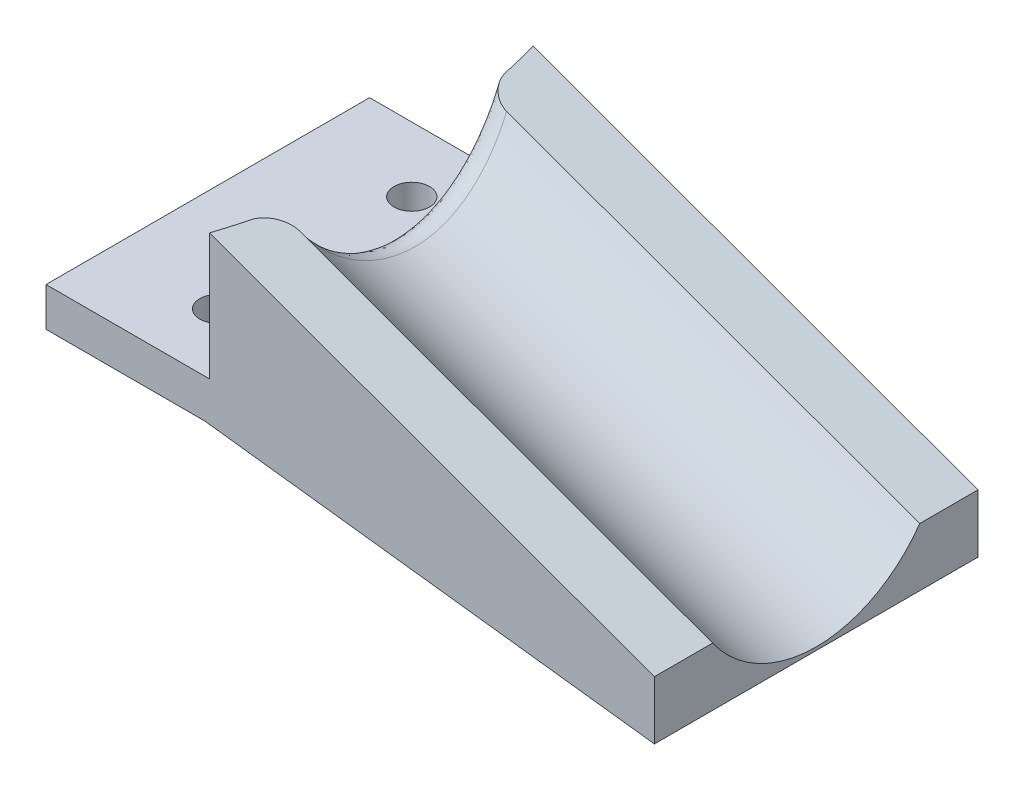
ISO-10303-21;
HEADER;
FILE_DESCRIPTION(('STEP AP214'),'2;1');
FILE_NAME('part.step','',(''),(''),'','','');
FILE_SCHEMA(('AUTOMOTIVE_DESIGN { 1 0 10303 214 1 1 1 1 }'));
ENDSEC;
DATA;
#1=APPLICATION_CONTEXT('core data for automotive mechanical design processes');
#2=APPLICATION_PROTOCOL_DEFINITION('international standard','automotive_design',2000,#1);
#3=PRODUCT_CONTEXT('',#1,'mechanical');
#4=PRODUCT('Part','Part','',(#3));
#5=PRODUCT_RELATED_PRODUCT_CATEGORY('part','',(#4));
#6=PRODUCT_DEFINITION_FORMATION('','',#4);
#7=PRODUCT_DEFINITION_CONTEXT('part definition',#1,'design');
#8=PRODUCT_DEFINITION('design','',#6,#7);
#9=PRODUCT_DEFINITION_SHAPE('','',#8);
#10=(LENGTH_UNIT() NAMED_UNIT(*) SI_UNIT(.MILLI.,.METRE.));
#11=(NAMED_UNIT(*) PLANE_ANGLE_UNIT() SI_UNIT($,.RADIAN.));
#12=(NAMED_UNIT(*) SI_UNIT($,.STERADIAN.) SOLID_ANGLE_UNIT());
#13=UNCERTAINTY_MEASURE_WITH_UNIT(LENGTH_MEASURE(1.E-05),#10,'distance_accuracy_value','');
#14=(GEOMETRIC_REPRESENTATION_CONTEXT(3) GLOBAL_UNCERTAINTY_ASSIGNED_CONTEXT((#13)) GLOBAL_UNIT_ASSIGNED_CONTEXT((#10,
#11,#12)) REPRESENTATION_CONTEXT('',''));
#15=CARTESIAN_POINT('',(0.,0.,0.));
#16=DIRECTION('',(0.,0.,1.));
#17=DIRECTION('',(1.,0.,0.));
#18=AXIS2_PLACEMENT_3D('',#15,#16,#17);
#19=CARTESIAN_POINT('',(-24.5152899298143,26.,50.));
#20=DIRECTION('',(1.,0.,0.));
#21=DIRECTION('',(0.,1.,0.));
#22=AXIS2_PLACEMENT_3D('',#19,#20,#21);
#23=PLANE('',#22);
#24=DIRECTION('',(0.,0.,1.));
#25=VECTOR('',#24,1.);
#26=CARTESIAN_POINT('',(-24.5152899298143,6.,50.));
#27=LINE('',#26,#25);
#28=CARTESIAN_POINT('',(-24.5152899298143,6.,0.));
#29=VERTEX_POINT('',#28);
#30=CARTESIAN_POINT('',(-24.5152899298143,6.,50.));
#31=VERTEX_POINT('',#30);
#32=EDGE_CURVE('E120',#29,#31,#27,.T.);
#33=ORIENTED_EDGE('',*,*,#32,.F.);
#34=DIRECTION('',(0.,-1.,0.));
#35=VECTOR('',#34,1.);
#36=CARTESIAN_POINT('',(-24.5152899298143,26.,0.));
#37=LINE('',#36,#35);
#38=CARTESIAN_POINT('',(-24.5152899298143,0.,0.));
#39=VERTEX_POINT('',#38);
#40=EDGE_CURVE('E150',#29,#39,#37,.T.);
#41=ORIENTED_EDGE('',*,*,#40,.T.);
#42=DIRECTION('',(0.,0.,-1.));
#43=VECTOR('',#42,1.);
#44=CARTESIAN_POINT('',(-24.5152899298143,0.,50.));
#45=LINE('',#44,#43);
#46=CARTESIAN_POINT('',(-24.5152899298143,0.,50.));
#47=VERTEX_POINT('',#46);
#48=EDGE_CURVE('E181',#47,#39,#45,.T.);
#49=ORIENTED_EDGE('',*,*,#48,.F.);
#50=DIRECTION('',(0.,-1.,0.));
#51=VECTOR('',#50,1.);
#52=CARTESIAN_POINT('',(-24.5152899298143,26.,50.));
#53=LINE('',#52,#51);
#54=EDGE_CURVE('E151',#31,#47,#53,.T.);
#55=ORIENTED_EDGE('',*,*,#54,.F.);
#56=EDGE_LOOP('',(#33,#41,#49,#55));
#57=FACE_BOUND('',#56,.T.);
#58=ADVANCED_FACE('F35',(#57),#23,.F.);
#59=CARTESIAN_POINT('',(69.4847100701857,0.522083601365774,50.));
#60=DIRECTION('',(-0.342020143325669,-0.939692620785908,0.));
#61=DIRECTION('',(0.939692620785908,-0.342020143325669,0.));
#62=AXIS2_PLACEMENT_3D('',#59,#60,#61);
#63=PLANE('',#62);
#64=DIRECTION('',(-0.939692620785908,0.342020143325669,0.));
#65=VECTOR('',#64,1.);
#66=CARTESIAN_POINT('',(72.3772543137752,-0.530716404598843,41.));
#67=LINE('',#66,#65);
#68=CARTESIAN_POINT('',(69.4847100701857,0.522083601365774,41.));
#69=VERTEX_POINT('',#68);
#70=CARTESIAN_POINT('',(5.6631072728891,23.7512473227424,41.));
#71=VERTEX_POINT('',#70);
#72=EDGE_CURVE('E148',#69,#71,#67,.T.);
#73=ORIENTED_EDGE('',*,*,#72,.T.);
#74=CARTESIAN_POINT('',(4.53305028891192,32.6141130901676,44.5839617815843));
#75=CARTESIAN_POINT('',(1.87655288740507,32.5537543773198,44.3839362590256));
#76=CARTESIAN_POINT('',(1.37953567465181,32.0421034885877,46.9513900729025));
#77=CARTESIAN_POINT('',(4.5907164275636,31.9627858274667,44.4612343720084));
#78=CARTESIAN_POINT('',(1.90363779418791,31.8954424572678,44.227156099155));
#79=CARTESIAN_POINT('',(1.4061231947591,31.3072857898055,46.813826628591));
#80=CARTESIAN_POINT('',(4.65379046659992,31.3166624031764,44.3118541580335));
#81=CARTESIAN_POINT('',(1.93507341233363,31.2490142478684,44.042789608648));
#82=CARTESIAN_POINT('',(1.43831871577798,30.5786219050923,46.6463884267401));
#83=CARTESIAN_POINT('',(4.78921905508307,30.0392365502929,43.9612771985362));
#84=CARTESIAN_POINT('',(2.00533760430166,29.9778318773506,43.621416944562));
#85=CARTESIAN_POINT('',(1.51261045572394,29.1385256264655,46.2534315941969));
#86=CARTESIAN_POINT('',(4.86157338130341,29.4079337656384,43.7600816992529));
#87=CARTESIAN_POINT('',(2.04428383174336,29.352837107054,43.3836043332659));
#88=CARTESIAN_POINT('',(1.55470643652728,28.4270928185674,46.0279143603968));
#89=CARTESIAN_POINT('',(5.01418836533513,28.1632405953843,43.3068874500854));
#90=CARTESIAN_POINT('',(2.12823185432664,28.1284480842535,42.857454486016));
#91=CARTESIAN_POINT('',(1.64758146535138,27.0248933156347,45.5199352367412));
#92=CARTESIAN_POINT('',(5.09446511889189,27.5498901005874,43.0547841389684));
#93=CARTESIAN_POINT('',(2.17335292237186,27.5290582403861,42.5681772516031));
#94=CARTESIAN_POINT('',(1.69837835131933,26.3341725710333,45.237356145656));
#95=CARTESIAN_POINT('',(5.26098201093775,26.3468355127653,42.5015462815861));
#96=CARTESIAN_POINT('',(2.2679464329965,26.3620400388248,41.9424941783369));
#97=CARTESIAN_POINT('',(1.80699763594809,24.9797970176115,44.6172395346495));
#98=CARTESIAN_POINT('',(5.34722217414156,25.7571315177564,42.2004115321086));
#99=CARTESIAN_POINT('',(2.31750625340779,25.794538766886,41.6052516301065));
#100=CARTESIAN_POINT('',(1.86482006372622,24.3161423209815,44.2797017869502));
#101=CARTESIAN_POINT('',(5.52372675286616,24.6054918837898,41.5504706943836));
#102=CARTESIAN_POINT('',(2.41925930650299,24.6956600763219,40.8867768528871));
#103=CARTESIAN_POINT('',(1.98576091216141,23.0204733005394,43.5511921517319));
#104=CARTESIAN_POINT('',(5.6139933595141,24.0435717238455,41.2016384312954));
#105=CARTESIAN_POINT('',(2.47151126806748,24.1646461618615,40.5047374896402));
#106=CARTESIAN_POINT('',(2.04888223328463,22.38847661162,43.1601909251983));
#107=CARTESIAN_POINT('',(5.79633726216196,22.9524609385074,40.4580661818827));
#108=CARTESIAN_POINT('',(2.5768053793304,23.1435537734331,39.7005601106313));
#109=CARTESIAN_POINT('',(2.17845860652451,21.1616351959335,42.3267311443745));
#110=CARTESIAN_POINT('',(5.88841449858941,22.4232692386641,40.0633277038499));
#111=CARTESIAN_POINT('',(2.62986736249774,22.6540345137052,39.2777438399405));
#112=CARTESIAN_POINT('',(2.24491354907116,20.5667892495306,41.8842742807074));
#113=CARTESIAN_POINT('',(6.07205162024009,21.4024755703972,39.2297869969698));
#114=CARTESIAN_POINT('',(2.73496063759829,21.7201316963794,38.396206932468));
#115=CARTESIAN_POINT('',(2.37907662084911,19.4196410323435,40.9499701086291));
#116=CARTESIAN_POINT('',(6.1636115624363,20.9108693846297,38.7909897246308));
#117=CARTESIAN_POINT('',(2.7869684956093,21.2765231173063,37.9369810719154));
#118=CARTESIAN_POINT('',(2.44678460841838,18.8673339883607,40.4581283558989));
#119=CARTESIAN_POINT('',(6.34376456883833,19.9702989377582,37.8714381699681));
#120=CARTESIAN_POINT('',(2.88821182592266,20.4381436092399,36.9872236077461));
#121=CARTESIAN_POINT('',(2.58126175938907,17.8108668596887,39.4274158221595));
#122=CARTESIAN_POINT('',(6.4323578747926,19.5213311965851,37.3906873179725));
#123=CARTESIAN_POINT('',(2.93737875071517,20.0443503456445,36.4964269888582));
#124=CARTESIAN_POINT('',(2.64803099902969,17.3067028456383,38.8885488861572));
#125=CARTESIAN_POINT('',(6.60056685077466,18.6884933652248,36.4100063463968));
#126=CARTESIAN_POINT('',(3.02943602337729,19.323733481519,35.5091527792525));
#127=CARTESIAN_POINT('',(2.77572443137881,16.3716620658836,37.7893172401707));
#128=CARTESIAN_POINT('',(6.68040044754672,18.3027288224037,35.911630297307));
#129=CARTESIAN_POINT('',(3.07242707597662,18.9956680939999,35.0134509354231));
#130=CARTESIAN_POINT('',(2.83677574312848,15.9386504270259,37.2306944661599));
#131=CARTESIAN_POINT('',(6.83268306911995,17.5802943352104,34.8815874726918));
#132=CARTESIAN_POINT('',(3.1532043497128,18.3894485089438,34.0025341029411));
#133=CARTESIAN_POINT('',(2.95386133756742,15.127868487638,36.0761338064164));
#134=CARTESIAN_POINT('',(6.9051333978232,17.2436157176126,34.3499266022083));
#135=CARTESIAN_POINT('',(3.19086684789304,18.1123750336852,33.4876799966404));
#136=CARTESIAN_POINT('',(3.00989650590586,14.7500884279446,35.4802025395629));
#137=CARTESIAN_POINT('',(7.04025067353508,16.6248811970469,33.2581380251989));
#138=CARTESIAN_POINT('',(3.25999887680914,17.6098452339943,32.4442261889963));
#139=CARTESIAN_POINT('',(3.11483046576302,14.0559143360374,34.2564319257144));
#140=CARTESIAN_POINT('',(7.10293996885691,16.342700152228,32.6980793570326));
#141=CARTESIAN_POINT('',(3.29134534336336,17.3853532809383,31.9163499549499));
#142=CARTESIAN_POINT('',(3.16374554178713,13.7393796639087,33.6286699628554));
#143=CARTESIAN_POINT('',(7.21660143061719,15.8367621720135,31.5531395982926));
#144=CARTESIAN_POINT('',(3.34733316917991,16.9875796062449,30.8501958333593));
#145=CARTESIAN_POINT('',(3.25270007610988,13.1719080252645,32.3453229294817));
#146=CARTESIAN_POINT('',(7.26758034513614,15.6129715790999,30.9682730345818));
#147=CARTESIAN_POINT('',(3.37184244389363,16.8152741198281,30.3129714410826));
#148=CARTESIAN_POINT('',(3.29274464554091,12.9209332684992,31.6897541419253));
#149=CARTESIAN_POINT('',(7.35567990056732,15.2292342026559,29.7835348244873));
#150=CARTESIAN_POINT('',(3.41368670755242,16.522504141323,29.2356577419733));
#151=CARTESIAN_POINT('',(3.36208927294274,12.4906157951227,30.3617975785881));
#152=CARTESIAN_POINT('',(7.39290746296024,15.0687941426516,29.1838193780346));
#153=CARTESIAN_POINT('',(3.43096315640296,16.4024505397482,28.696926730168));
#154=CARTESIAN_POINT('',(3.39147219577757,12.3107196205105,29.6895848851348));
#155=CARTESIAN_POINT('',(7.45266868784675,14.8124011485189,27.970960079815));
#156=CARTESIAN_POINT('',(3.45850484663513,16.2115154029474,27.6148132126574));
#157=CARTESIAN_POINT('',(3.43869499669692,12.0232475527969,28.330107785675));
#158=CARTESIAN_POINT('',(7.47520212818264,14.7164491893733,27.3578160251684));
#159=CARTESIAN_POINT('',(3.46868648143873,16.1412169347822,27.073005365601));
#160=CARTESIAN_POINT('',(3.45653470026162,11.915672753108,27.6428431522632));
#161=CARTESIAN_POINT('',(7.50191951281904,14.6028494231033,26.2411713971609));
#162=CARTESIAN_POINT('',(3.48074829758522,16.0579933328177,26.0892104826803));
#163=CARTESIAN_POINT('',(3.47769473562816,11.788314339485,26.3912117369429));
#164=CARTESIAN_POINT('',(7.50876011034656,14.5738573543196,25.7387701656128));
#165=CARTESIAN_POINT('',(3.48380756073559,16.0369167393848,25.6484441105287));
#166=CARTESIAN_POINT('',(3.48311684807557,11.7558119534134,25.8280771919631));
#167=CARTESIAN_POINT('',(7.51201650039116,14.5600456611167,24.7332078617102));
#168=CARTESIAN_POINT('',(3.4852697835641,16.0268392980283,24.7657120262507));
#169=CARTESIAN_POINT('',(3.48569749796867,11.740327842874,24.7009564070174));
#170=CARTESIAN_POINT('',(7.50842954121323,14.5752376963017,24.2300466238172));
#171=CARTESIAN_POINT('',(3.4836683859264,16.0378684712325,24.3246928714767));
#172=CARTESIAN_POINT('',(3.48285385419008,11.7573591897071,24.1369699815018));
#173=CARTESIAN_POINT('',(7.49090725056016,14.6496515433464,23.2264288528551));
#174=CARTESIAN_POINT('',(3.47577732623572,16.0922838931896,23.4418629968749));
#175=CARTESIAN_POINT('',(3.46897209338013,11.8407846654846,23.0120287964548));
#176=CARTESIAN_POINT('',(7.47696158601401,14.7089173199489,22.725975523449));
#177=CARTESIAN_POINT('',(3.46949976716955,16.135586659722,23.0009876648862));
#178=CARTESIAN_POINT('',(3.45792579399528,11.907228084301,22.4510776278647));
#179=CARTESIAN_POINT('',(7.43907690131357,14.870689720941,21.7319925033563));
#180=CARTESIAN_POINT('',(3.4522211050532,16.2550681171054,22.1198069657589));
#181=CARTESIAN_POINT('',(3.42795375124514,12.0886013936474,21.3369359009152));
#182=CARTESIAN_POINT('',(7.41513849183118,14.9731937029819,21.2384623914859));
#183=CARTESIAN_POINT('',(3.44125587256646,16.3309979329677,21.680387721071));
#184=CARTESIAN_POINT('',(3.40902848937546,12.2035283212805,20.7837448704568));
#185=CARTESIAN_POINT('',(7.35795667482965,15.2197196161397,20.2631037559178));
#186=CARTESIAN_POINT('',(3.41463353797897,16.5160819293447,20.8045849147502));
#187=CARTESIAN_POINT('',(3.36390026880616,12.4799507310892,19.6904789567912));
#188=CARTESIAN_POINT('',(7.32473908444825,15.3636263865187,19.781246740084));
#189=CARTESIAN_POINT('',(3.39904107182342,16.6247816336948,20.3689985549127));
#190=CARTESIAN_POINT('',(3.33771750394141,12.6413170437234,19.1503721371452));
#191=CARTESIAN_POINT('',(7.24977980133243,15.6912486121408,18.8309374571792));
#192=CARTESIAN_POINT('',(3.36321494482865,16.8760161201158,19.5013678588864));
#193=CARTESIAN_POINT('',(3.27876844274802,13.0087202077874,18.0851836940905));
#194=CARTESIAN_POINT('',(7.20803799008482,15.8749646208583,18.3624853765817));
#195=CARTESIAN_POINT('',(3.34304467433076,17.0180968838208,19.070004856108));
#196=CARTESIAN_POINT('',(3.24600205488664,13.2147576802877,17.5601022796974));
#197=CARTESIAN_POINT('',(7.11700586272657,16.280009829298,17.4418326697809));
#198=CARTESIAN_POINT('',(3.2982322100214,17.3363786624571,18.2130544754454));
#199=CARTESIAN_POINT('',(3.17475016856622,13.6690639024286,16.5281554798601));
#200=CARTESIAN_POINT('',(7.06771709858899,16.5013312967699,16.9896287258249));
#201=CARTESIAN_POINT('',(3.27366151033478,17.512050708011,17.7880143642498));
#202=CARTESIAN_POINT('',(3.13626584600477,13.9173239704758,16.0212863755933));
#203=CARTESIAN_POINT('',(6.96264306064047,16.9793235116096,16.1035729504581));
#204=CARTESIAN_POINT('',(3.2203318561526,17.8975576443004,16.9459403207897));
#205=CARTESIAN_POINT('',(3.05451506631181,14.4535623257063,15.0281187944673));
#206=CARTESIAN_POINT('',(6.9068552800103,17.2360079062845,15.6697282891913));
#207=CARTESIAN_POINT('',(3.19164328035692,18.1068467432569,16.5293111532264));
#208=CARTESIAN_POINT('',(3.01124676421977,14.7415559469767,14.5418283545227));
#209=CARTESIAN_POINT('',(6.78739465968132,17.7940827823162,14.8041178652171));
#210=CARTESIAN_POINT('',(3.12919529101826,18.5688621500089,15.6891404433941));
#211=CARTESIAN_POINT('',(2.91899054481312,15.3677906150537,13.5715776831089));
#212=CARTESIAN_POINT('',(6.72348440641157,18.0969321045106,14.3732631872895));
#213=CARTESIAN_POINT('',(3.09533011897519,18.8225630545853,15.2661656864722));
#214=CARTESIAN_POINT('',(2.86983571291649,15.7076722855432,13.0886386738844));
#215=CARTESIAN_POINT('',(6.59117907824705,18.7355212581285,13.5357211193824));
#216=CARTESIAN_POINT('',(3.0241598238295,19.3656521052173,14.4350274326527));
#217=CARTESIAN_POINT('',(2.76862354435009,16.4244663841375,12.1498494318851));
#218=CARTESIAN_POINT('',(6.52278238859705,19.0712729534682,13.1290425323532));
#219=CARTESIAN_POINT('',(2.98692007380614,19.6544325851048,14.0269934125229));
#220=CARTESIAN_POINT('',(2.71656516365735,16.801392169728,11.6940090662145));
#221=CARTESIAN_POINT('',(6.31288955054332,20.123607186332,11.9478394642142));
#222=CARTESIAN_POINT('',(2.87185612008372,20.5667729851082,12.8369212502435));
#223=CARTESIAN_POINT('',(2.55784408671531,17.9829928407718,10.3700149943784));
#224=CARTESIAN_POINT('',(6.16662162290354,20.8855837764379,11.2116648957874));
#225=CARTESIAN_POINT('',(2.78953828394778,21.2444605955688,12.0735735716865));
#226=CARTESIAN_POINT('',(2.44858180929528,18.8388443296344,9.54484717171022));
#227=CARTESIAN_POINT('',(5.8541312301595,22.6061719515549,9.77038824974115));
#228=CARTESIAN_POINT('',(2.6113262167257,22.810896882173,10.5565340701294));
#229=CARTESIAN_POINT('',(2.21950622380905,20.7722652715139,7.92934024640782));
#230=CARTESIAN_POINT('',(5.68763802497076,23.5774220362051,9.07985473707694));
#231=CARTESIAN_POINT('',(2.5148588763322,23.7134777707001,9.80997003325081));
#232=CARTESIAN_POINT('',(2.10001826468698,21.8641341832526,7.15533084509691));
#233=CARTESIAN_POINT('',(5.3651876479055,25.6169919525797,7.85071725493547));
#234=CARTESIAN_POINT('',(2.32861556748168,25.6476597729751,8.46125733717493));
#235=CARTESIAN_POINT('',(1.87605300804926,24.1583069004109,5.77760775601235));
#236=CARTESIAN_POINT('',(5.20923671708529,26.6853684209689,7.31220269232119));
#237=CARTESIAN_POINT('',(2.23857724959962,26.67690800817,7.85475444377554));
#238=CARTESIAN_POINT('',(1.77158456160334,25.3606751450876,5.17399428314889));
#239=CARTESIAN_POINT('',(4.98522816156211,28.3920791965706,6.60422531915129));
#240=CARTESIAN_POINT('',(2.11219465976364,28.3527995642536,7.0403586658822));
#241=CARTESIAN_POINT('',(1.62961194371265,27.2826462079724,4.38043230418634));
#242=CARTESIAN_POINT('',(4.90931479161571,29.0064117108183,6.37799538524189));
#243=CARTESIAN_POINT('',(2.07022493314932,28.9569069509776,6.77750793504985));
#244=CARTESIAN_POINT('',(1.58318874410986,27.9746893982846,4.12685432107351));
#245=CARTESIAN_POINT('',(4.76574504467524,30.2520898001435,5.97533258928428));
#246=CARTESIAN_POINT('',(1.99298303194001,30.1889977018624,6.3034152030862));
#247=CARTESIAN_POINT('',(1.49933093467453,29.378440338503,3.67551519966672));
#248=CARTESIAN_POINT('',(4.69808899537384,30.8834360491999,5.79890170315218));
#249=CARTESIAN_POINT('',(1.95760177832788,30.8171218907418,6.09137523405266));
#250=CARTESIAN_POINT('',(1.46189668151232,30.0901488674565,3.47775627614963));
#251=CARTESIAN_POINT('',(4.57251735263863,32.1587036177238,5.49737118094671));
#252=CARTESIAN_POINT('',(1.89490323309935,32.0919623600338,5.72149323461968));
#253=CARTESIAN_POINT('',(1.39727950753432,31.5282761840073,3.13977491229285));
#254=CARTESIAN_POINT('',(4.51460184484876,32.8026250477033,5.37227199619464));
#255=CARTESIAN_POINT('',(1.86746963298648,32.7389781570318,5.56289009717443));
#256=CARTESIAN_POINT('',(1.37009667685179,32.2546951008831,2.9995529778329));
#257=CARTESIAN_POINT('',(4.40963140338303,34.0986807573283,5.17474912559861));
#258=CARTESIAN_POINT('',(1.82170052508191,34.0460718692747,5.30188295575716));
#259=CARTESIAN_POINT('',(1.32688829105631,33.7173571818297,2.77815234235223));
#260=CARTESIAN_POINT('',(4.36257766696308,34.7508159340002,5.10233124474362));
#261=CARTESIAN_POINT('',(1.80325224535754,34.7065824180638,5.19879175900879));
#262=CARTESIAN_POINT('',(1.31086396551499,34.4536014194597,2.69698014806283));
#263=CARTESIAN_POINT('',(4.32152108048466,35.4048078909105,5.05693903261852));
#264=CARTESIAN_POINT('',(1.78980619917299,35.3742814629257,5.12458696253603));
#265=CARTESIAN_POINT('',(1.30087477691892,35.1922374911578,2.64610064985279));
#266=(BOUNDED_SURFACE() B_SPLINE_SURFACE(3,2,((#74,#75,#76),(#77,#78,#79),(#80,#81,#82),(#83,
#84,#85),(#86,#87,#88),(#89,#90,#91),(#92,#93,#94),(#95,#96,#97),(#98,#99,#100),(#101,#102,
#103),(#104,#105,#106),(#107,#108,#109),(#110,#111,#112),(#113,#114,#115),(#116,#117,#118),
(#119,#120,#121),(#122,#123,#124),(#125,#126,#127),(#128,#129,#130),(#131,#132,#133),(#134,#135,
#136),(#137,#138,#139),(#140,#141,#142),(#143,#144,#145),(#146,#147,#148),(#149,#150,#151),
(#152,#153,#154),(#155,#156,#157),(#158,#159,#160),(#161,#162,#163),(#164,#165,#166),(#167,#168,
#169),(#170,#171,#172),(#173,#174,#175),(#176,#177,#178),(#179,#180,#181),(#182,#183,#184),
(#185,#186,#187),(#188,#189,#190),(#191,#192,#193),(#194,#195,#196),(#197,#198,#199),(#200,#201,
#202),(#203,#204,#205),(#206,#207,#208),(#209,#210,#211),(#212,#213,#214),(#215,#216,#217),
(#218,#219,#220),(#221,#222,#223),(#224,#225,#226),(#227,#228,#229),(#230,#231,#232),(#233,#234,
#235),(#236,#237,#238),(#239,#240,#241),(#242,#243,#244),(#245,#246,#247),(#248,#249,#250),
(#251,#252,#253),(#254,#255,#256),(#257,#258,#259),(#260,#261,#262),(#263,#264,#265)),
.UNSPECIFIED.,.F.,.F.,.F.) B_SPLINE_SURFACE_WITH_KNOTS((4,2,2,2,2,2,2,2,2,2,2,2,2,2,2,2,2,2,2,2,
2,2,2,2,2,2,2,2,2,2,2,4),(3,3),(0.,2.24549437416309,4.49093474569903,6.74103488954967,
8.99114435925151,11.2424936087554,13.4937689089686,15.7447912292914,17.9956296672571,
20.1557451983965,22.3154785846704,24.4701920563089,26.623660746846,28.7600142795506,
30.8964001106385,32.630415927975,34.364889370803,36.1010953222934,37.8371951871176,
39.5685120646177,41.2998530144478,43.0308384042651,44.7624936993463,46.5694633943281,
48.3770870596153,51.9903736092993,56.0413936274166,60.0947912305226,62.3152419306339,
64.5357807209385,66.7563390343631,68.9771419955815),(0.,1.),
.UNSPECIFIED.) GEOMETRIC_REPRESENTATION_ITEM() RATIONAL_B_SPLINE_SURFACE(((1.,0.747652509132103,
1.),(1.,0.743543608928875,1.),(1.,0.739269811507675,1.),(1.,0.730434793292122,1.),(1.,
0.72587357941258,1.),(1.,0.716496177666241,1.),(1.,0.711679480316465,1.),(1.,0.701854432496948,
1.),(1.,0.696846081232955,1.),(1.,0.686700239491115,1.),(1.,0.681562679379778,1.),(1.,
0.671239903309942,1.),(1.,0.666054688922322,1.),(1.,0.655730563656766,1.),(1.,0.650591647641097,
1.),(1.,0.64046963116378,1.),(1.,0.635486518008102,1.),(1.,0.625997474219729,1.),(1.,
0.62148040568197,1.),(1.,0.61283080760902,1.),(1.,0.608698210186612,1.),(1.,0.600958145745073,
1.),(1.,0.597349480480316,1.),(1.,0.590780037421081,1.),(1.,0.587818886545424,1.),(1.,
0.582684515671186,1.),(1.,0.580505220466293,1.),(1.,0.576999334156045,1.),(1.,0.575672755942765,
1.),(1.,0.574098693044997,1.),(1.,0.57369502736633,1.),(1.,0.573502938627878,1.),(1.,
0.573714677965374,1.),(1.,0.574747623529273,1.),(1.,0.57556943832091,1.),(1.,0.577796848095021,
1.),(1.,0.579202407403949,1.),(1.,0.58254961343984,1.),(1.,0.584489772567651,1.),(1.,
0.588852261127379,1.),(1.,0.591274597263046,1.),(1.,0.596536863413126,1.),(1.,0.599376707565443,
1.),(1.,0.605407261378872,1.),(1.,0.608598106402418,1.),(1.,0.615406199703811,1.),(1.,
0.619035957563381,1.),(1.,0.626527062093578,1.),(1.,0.630388492104345,1.),(1.,0.642212186636143,
1.),(1.,0.650417780027437,1.),(1.,0.667978719288027,1.),(1.,0.677352925287886,1.),(1.,
0.695772689867928,1.),(1.,0.704818052332515,1.),(1.,0.718257019635561,1.),(1.,0.722904509334962,
1.),(1.,0.731941318946988,1.),(1.,0.73633062861013,1.),(1.,0.744809849344668,1.),(1.,
0.748899757783392,1.),(1.,0.756751573636145,1.),(1.,0.760513444863345,1.),(1.,0.764096562143947,1.))) REPRESENTATION_ITEM('') SURFACE());
#267=CARTESIAN_POINT('',(5.6631072728891,23.7512473227424,41.));
#268=CARTESIAN_POINT('',(5.57024106465918,23.7850478583073,41.0000079816178));
#269=CARTESIAN_POINT('',(5.47750097545247,23.8188024903017,41.0051876514151));
#270=CARTESIAN_POINT('',(5.29308056431593,23.8859260305465,41.0249743158623));
#271=CARTESIAN_POINT('',(5.20139854917911,23.9192955550739,41.0395631865113));
#272=CARTESIAN_POINT('',(4.93011106712842,24.0180361234693,41.0957962245089));
#273=CARTESIAN_POINT('',(4.75271478587412,24.0826030895154,41.1499378587629));
#274=CARTESIAN_POINT('',(4.47113585682152,24.1850894382871,41.2605151515058));
#275=CARTESIAN_POINT('',(4.36397011639816,24.2240945779343,41.3088217966308));
#276=CARTESIAN_POINT('',(4.15395450343491,24.3005340097841,41.4151333682558));
#277=CARTESIAN_POINT('',(4.05110520374652,24.3379680934858,41.4731395769627));
#278=CARTESIAN_POINT('',(3.74900884471548,24.4479221760533,41.6605792048887));
#279=CARTESIAN_POINT('',(3.55685956487003,24.5178587944527,41.8031694615902));
#280=CARTESIAN_POINT('',(3.19184016098515,24.6507149923964,42.1194882546938));
#281=CARTESIAN_POINT('',(3.0193281152892,24.7135042420821,42.2936789410327));
#282=CARTESIAN_POINT('',(2.70045340453645,24.8295651452564,42.667260962568));
#283=CARTESIAN_POINT('',(2.55407712409438,24.8828417543399,42.8666390834266));
#284=CARTESIAN_POINT('',(2.29531926055471,24.9770219145507,43.2813308516673));
#285=CARTESIAN_POINT('',(2.1821306877692,25.0182191859037,43.496073140643));
#286=CARTESIAN_POINT('',(1.99019393682071,25.0880784501107,43.9420018446471));
#287=CARTESIAN_POINT('',(1.9113412145141,25.1167784939211,44.1731358160119));
#288=CARTESIAN_POINT('',(1.82981258956069,25.1464524866448,44.5035402785987));
#289=CARTESIAN_POINT('',(1.80988667743315,25.1537049255498,44.598180896026));
#290=CARTESIAN_POINT('',(1.79339254093401,25.1597083002755,44.6934962429832));
#291=B_SPLINE_CURVE_WITH_KNOTS('',3,(#267,#268,#269,#270,#271,#272,#273,#274,#275,#276,#277,
#278,#279,#280,#281,#282,#283,#284,#285,#286,#287,#288,#289,#290),.UNSPECIFIED.,.F.,.F.,(4,2,2,
2,2,2,2,2,2,2,2,4),(0.,0.296125218369335,0.591681737053833,1.1779194715888,1.54908015889758,
1.9202899496048,2.66489222635796,3.42142048466421,4.17755347353873,4.91339129246057,
5.64697272939653,5.93769988340286),.UNSPECIFIED.);
#292=CARTESIAN_POINT('',(1.79339254093401,25.1597083002755,44.6934962429831));
#293=VERTEX_POINT('',#292);
#294=EDGE_CURVE('E61',#71,#293,#291,.T.);
#295=ORIENTED_EDGE('',*,*,#294,.T.);
#296=CARTESIAN_POINT('',(-112.015289929814,66.5826811206817,25.));
#297=DIRECTION('',(-0.342020143325669,-0.939692620785908,0.));
#298=DIRECTION('',(-0.939692620785908,0.342020143325669,0.));
#299=AXIS2_PLACEMENT_3D('',#296,#297,#298);
#300=ELLIPSE('',#299,122.912532720968,115.5);
#301=CARTESIAN_POINT('',(0.746627400461747,25.5406996536748,50.));
#302=VERTEX_POINT('',#301);
#303=EDGE_CURVE('E140',#293,#302,#300,.T.);
#304=ORIENTED_EDGE('',*,*,#303,.T.);
#305=DIRECTION('',(-0.939692620785908,0.342020143325669,0.));
#306=VECTOR('',#305,1.);
#307=CARTESIAN_POINT('',(69.4847100701857,0.522083601365774,50.));
#308=LINE('',#307,#306);
#309=CARTESIAN_POINT('',(69.4847100701857,0.522083601365774,50.));
#310=VERTEX_POINT('',#309);
#311=EDGE_CURVE('E137',#310,#302,#308,.T.);
#312=ORIENTED_EDGE('',*,*,#311,.F.);
#313=DIRECTION('',(0.,0.,-1.));
#314=VECTOR('',#313,1.);
#315=CARTESIAN_POINT('',(69.4847100701857,0.522083601365774,50.));
#316=LINE('',#315,#314);
#317=EDGE_CURVE('E172',#310,#69,#316,.T.);
#318=ORIENTED_EDGE('',*,*,#317,.T.);
#319=EDGE_LOOP('',(#73,#295,#304,#312,#318));
#320=FACE_BOUND('',#319,.T.);
#321=ADVANCED_FACE('F242',(#320),#63,.F.);
#322=CARTESIAN_POINT('',(-24.5152899298143,0.,50.));
#323=DIRECTION('',(0.,1.,0.));
#324=DIRECTION('',(0.,0.,1.));
#325=AXIS2_PLACEMENT_3D('',#322,#323,#324);
#326=PLANE('',#325);
#327=CARTESIAN_POINT('',(-8.,0.,9.99999999999999));
#328=DIRECTION('',(0.,-1.,0.));
#329=DIRECTION('',(0.,0.,1.));
#330=AXIS2_PLACEMENT_3D('',#327,#328,#329);
#331=CIRCLE('',#330,2.75);
#332=CARTESIAN_POINT('',(-8.,0.,12.75));
#333=VERTEX_POINT('',#332);
#334=EDGE_CURVE('E193',#333,#333,#331,.T.);
#335=ORIENTED_EDGE('',*,*,#334,.F.);
#336=EDGE_LOOP('',(#335));
#337=FACE_BOUND('',#336,.T.);
#338=CARTESIAN_POINT('',(-8.,0.,40.));
#339=DIRECTION('',(0.,-1.,0.));
#340=DIRECTION('',(0.,0.,-1.));
#341=AXIS2_PLACEMENT_3D('',#338,#339,#340);
#342=CIRCLE('',#341,2.75);
#343=CARTESIAN_POINT('',(-8.,0.,37.25));
#344=VERTEX_POINT('',#343);
#345=EDGE_CURVE('E189',#344,#344,#342,.T.);
#346=ORIENTED_EDGE('',*,*,#345,.F.);
#347=EDGE_LOOP('',(#346));
#348=FACE_BOUND('',#347,.T.);
#349=DIRECTION('',(1.,0.,0.));
#350=VECTOR('',#349,1.);
#351=CARTESIAN_POINT('',(-24.5152899298143,0.,0.));
#352=LINE('',#351,#350);
#353=CARTESIAN_POINT('',(0.,0.,0.));
#354=VERTEX_POINT('',#353);
#355=EDGE_CURVE('E163',#39,#354,#352,.T.);
#356=ORIENTED_EDGE('',*,*,#355,.T.);
#357=DIRECTION('',(0.,0.,-1.));
#358=VECTOR('',#357,1.);
#359=CARTESIAN_POINT('',(0.,0.,50.));
#360=LINE('',#359,#358);
#361=CARTESIAN_POINT('',(0.,0.,50.));
#362=VERTEX_POINT('',#361);
#363=EDGE_CURVE('E178',#362,#354,#360,.T.);
#364=ORIENTED_EDGE('',*,*,#363,.F.);
#365=DIRECTION('',(1.,0.,0.));
#366=VECTOR('',#365,1.);
#367=CARTESIAN_POINT('',(-24.5152899298143,0.,50.));
#368=LINE('',#367,#366);
#369=EDGE_CURVE('E153',#47,#362,#368,.T.);
#370=ORIENTED_EDGE('',*,*,#369,.F.);
#371=ORIENTED_EDGE('',*,*,#48,.T.);
#372=EDGE_LOOP('',(#356,#364,#370,#371));
#373=FACE_BOUND('',#372,.T.);
#374=ADVANCED_FACE('F250',(#337,#348,#373),#326,.F.);
#375=CARTESIAN_POINT('',(0.,0.,50.));
#376=DIRECTION('',(0.12111309140906,0.992638715288368,0.));
#377=DIRECTION('',(-0.992638715288368,0.12111309140906,0.));
#378=AXIS2_PLACEMENT_3D('',#375,#376,#377);
#379=PLANE('',#378);
#380=DIRECTION('',(0.992638715288367,-0.12111309140906,0.));
#381=VECTOR('',#380,1.);
#382=CARTESIAN_POINT('',(0.,0.,0.));
#383=LINE('',#382,#381);
#384=CARTESIAN_POINT('',(69.4847100701857,-8.47791639863422,0.));
#385=VERTEX_POINT('',#384);
#386=EDGE_CURVE('E165',#354,#385,#383,.T.);
#387=ORIENTED_EDGE('',*,*,#386,.T.);
#388=DIRECTION('',(0.,0.,-1.));
#389=VECTOR('',#388,1.);
#390=CARTESIAN_POINT('',(69.4847100701857,-8.47791639863422,50.));
#391=LINE('',#390,#389);
#392=CARTESIAN_POINT('',(69.4847100701857,-8.47791639863422,50.));
#393=VERTEX_POINT('',#392);
#394=EDGE_CURVE('E175',#393,#385,#391,.T.);
#395=ORIENTED_EDGE('',*,*,#394,.F.);
#396=DIRECTION('',(0.992638715288367,-0.12111309140906,0.));
#397=VECTOR('',#396,1.);
#398=CARTESIAN_POINT('',(0.,0.,50.));
#399=LINE('',#398,#397);
#400=EDGE_CURVE('E156',#362,#393,#399,.T.);
#401=ORIENTED_EDGE('',*,*,#400,.F.);
#402=ORIENTED_EDGE('',*,*,#363,.T.);
#403=EDGE_LOOP('',(#387,#395,#401,#402));
#404=FACE_BOUND('',#403,.T.);
#405=ADVANCED_FACE('F247',(#404),#379,.F.);
#406=CARTESIAN_POINT('',(69.4847100701857,-8.47791639863422,50.));
#407=DIRECTION('',(-1.,0.,0.));
#408=DIRECTION('',(0.,0.,1.));
#409=AXIS2_PLACEMENT_3D('',#406,#407,#408);
#410=PLANE('',#409);
#411=CARTESIAN_POINT('',(69.4847100701857,0.522083601365772,9.00000000000004));
#412=VERTEX_POINT('',#411);
#413=CARTESIAN_POINT('',(69.4847100701857,0.522083601365774,0.));
#414=VERTEX_POINT('',#413);
#415=EDGE_CURVE('E161',#412,#414,#316,.T.);
#416=ORIENTED_EDGE('',*,*,#415,.F.);
#417=CARTESIAN_POINT('',(69.4847100701857,13.2922168710767,25.));
#418=DIRECTION('',(-1.,0.,0.));
#419=DIRECTION('',(0.,1.,0.));
#420=AXIS2_PLACEMENT_3D('',#417,#418,#419);
#421=ELLIPSE('',#420,21.2835554495182,20.);
#422=EDGE_CURVE('E145',#412,#69,#421,.T.);
#423=ORIENTED_EDGE('',*,*,#422,.T.);
#424=ORIENTED_EDGE('',*,*,#317,.F.);
#425=DIRECTION('',(0.,1.,0.));
#426=VECTOR('',#425,1.);
#427=CARTESIAN_POINT('',(69.4847100701857,-8.47791639863422,50.));
#428=LINE('',#427,#426);
#429=EDGE_CURVE('E158',#393,#310,#428,.T.);
#430=ORIENTED_EDGE('',*,*,#429,.F.);
#431=ORIENTED_EDGE('',*,*,#394,.T.);
#432=DIRECTION('',(0.,1.,0.));
#433=VECTOR('',#432,1.);
#434=CARTESIAN_POINT('',(69.4847100701857,-8.47791639863422,0.));
#435=LINE('',#434,#433);
#436=EDGE_CURVE('E167',#385,#414,#435,.T.);
#437=ORIENTED_EDGE('',*,*,#436,.T.);
#438=EDGE_LOOP('',(#416,#423,#424,#430,#431,#437));
#439=FACE_BOUND('',#438,.T.);
#440=ADVANCED_FACE('F240',(#439),#410,.F.);
#441=CARTESIAN_POINT('',(-112.015289929814,66.5826811206817,25.));
#442=DIRECTION('',(-0.342020143325669,-0.939692620785908,0.));
#443=DIRECTION('',(-0.939692620785908,0.342020143325669,0.));
#444=AXIS2_PLACEMENT_3D('',#441,#442,#443);
#445=ELLIPSE('',#444,122.912532720968,115.5);
#446=CARTESIAN_POINT('',(0.746627400461747,25.5406996536748,0.));
#447=VERTEX_POINT('',#446);
#448=CARTESIAN_POINT('',(1.793392540934,25.1597083002755,5.30650375701684));
#449=VERTEX_POINT('',#448);
#450=EDGE_CURVE('E132',#447,#449,#445,.T.);
#451=ORIENTED_EDGE('',*,*,#450,.T.);
#452=CARTESIAN_POINT('',(1.79339254093401,25.1597083002755,5.30650375701683));
#453=CARTESIAN_POINT('',(1.81527852876966,25.1517424521558,5.43286974625854));
#454=CARTESIAN_POINT('',(1.84316122736959,25.1415939798144,5.55796928015945));
#455=CARTESIAN_POINT('',(1.90987529014687,25.1173120467565,5.80466619317401));
#456=CARTESIAN_POINT('',(1.94869333023724,25.103183435611,5.92626763701033));
#457=CARTESIAN_POINT('',(2.03596690792342,25.0714184510954,6.16442446574794));
#458=CARTESIAN_POINT('',(2.08434893485395,25.0538088334192,6.28101055404493));
#459=CARTESIAN_POINT('',(2.1900641354486,25.0153316470932,6.50949341195194));
#460=CARTESIAN_POINT('',(2.24739999038329,24.9944631025408,6.62138876412376));
#461=CARTESIAN_POINT('',(2.42442692927203,24.9300305661221,6.93631036702728));
#462=CARTESIAN_POINT('',(2.55456497802793,24.8826641900294,7.13281214573529));
#463=CARTESIAN_POINT('',(2.84009448208658,24.7787399495473,7.5047865780533));
#464=CARTESIAN_POINT('',(2.99558407338715,24.7221463665757,7.68017271328126));
#465=CARTESIAN_POINT('',(3.35731697285888,24.5904863584131,8.03405818869324));
#466=CARTESIAN_POINT('',(3.56768883236545,24.5139172634255,8.20788216064309));
#467=CARTESIAN_POINT('',(3.9017505665082,24.3923287357902,8.4361841241524));
#468=CARTESIAN_POINT('',(4.01594486556782,24.3507654100096,8.50677150756728));
#469=CARTESIAN_POINT('',(4.25018838565852,24.2655077411269,8.63606764534891));
#470=CARTESIAN_POINT('',(4.37023636356592,24.2218138504847,8.69477890828502));
#471=CARTESIAN_POINT('',(4.58542920455155,24.1434900617388,8.78585940554485));
#472=CARTESIAN_POINT('',(4.6794842403983,24.1092568283077,8.82115934172805));
#473=CARTESIAN_POINT('',(4.87002540594006,24.0399055156481,8.88309286737233));
#474=CARTESIAN_POINT('',(4.96650957590287,24.0047881497038,8.90973321600339));
#475=CARTESIAN_POINT('',(5.16230547627875,23.9335242699756,8.95354947097603));
#476=CARTESIAN_POINT('',(5.2616348545727,23.8973713328884,8.97063790206056));
#477=CARTESIAN_POINT('',(5.46163807112248,23.8245761153068,8.99386464236763));
#478=CARTESIAN_POINT('',(5.56231452704457,23.7879328820598,8.99997703974805));
#479=CARTESIAN_POINT('',(5.6631072728891,23.7512473227424,9.00000000000004));
#480=B_SPLINE_CURVE_WITH_KNOTS('',3,(#452,#453,#454,#455,#456,#457,#458,#459,#460,#461,#462,
#463,#464,#465,#466,#467,#468,#469,#470,#471,#472,#473,#474,#475,#476,#477,#478,#479),
.UNSPECIFIED.,.F.,.F.,(4,2,2,2,2,2,2,2,2,2,2,2,2,4),(0.,0.385189211778122,0.769911107576525,
1.15178351815262,1.53377050247578,2.25215101322572,2.97338145003569,3.81894321407295,
4.24006433120862,4.6610964026647,4.97915947343862,5.29697368320194,5.6176526123257,
5.93908759887862),.UNSPECIFIED.);
#481=CARTESIAN_POINT('',(5.6631072728891,23.7512473227424,9.00000000000004));
#482=VERTEX_POINT('',#481);
#483=EDGE_CURVE('E11',#449,#482,#480,.T.);
#484=ORIENTED_EDGE('',*,*,#483,.T.);
#485=DIRECTION('',(-0.939692620785908,0.342020143325669,0.));
#486=VECTOR('',#485,1.);
#487=CARTESIAN_POINT('',(72.3772543137752,-0.530716404598843,9.00000000000004));
#488=LINE('',#487,#486);
#489=EDGE_CURVE('E124',#482,#412,#488,.F.);
#490=ORIENTED_EDGE('',*,*,#489,.T.);
#491=ORIENTED_EDGE('',*,*,#415,.T.);
#492=DIRECTION('',(-0.939692620785908,0.342020143325669,0.));
#493=VECTOR('',#492,1.);
#494=CARTESIAN_POINT('',(69.4847100701857,0.522083601365774,0.));
#495=LINE('',#494,#493);
#496=EDGE_CURVE('E154',#414,#447,#495,.T.);
#497=ORIENTED_EDGE('',*,*,#496,.T.);
#498=EDGE_LOOP('',(#451,#484,#490,#491,#497));
#499=FACE_BOUND('',#498,.T.);
#500=ADVANCED_FACE('F235',(#499),#63,.F.);
#501=CARTESIAN_POINT('',(0.,0.,50.));
#502=DIRECTION('',(0.,0.,1.));
#503=DIRECTION('',(1.,0.,0.));
#504=AXIS2_PLACEMENT_3D('',#501,#502,#503);
#505=PLANE('',#504);
#506=DIRECTION('',(0.,1.,0.));
#507=VECTOR('',#506,1.);
#508=CARTESIAN_POINT('',(0.746627400461719,6.,50.));
#509=LINE('',#508,#507);
#510=CARTESIAN_POINT('',(0.746627400461719,6.,50.));
#511=VERTEX_POINT('',#510);
#512=EDGE_CURVE('E128',#511,#302,#509,.T.);
#513=ORIENTED_EDGE('',*,*,#512,.F.);
#514=DIRECTION('',(-1.,0.,0.));
#515=VECTOR('',#514,1.);
#516=CARTESIAN_POINT('',(0.,6.,50.));
#517=LINE('',#516,#515);
#518=EDGE_CURVE('E114',#511,#31,#517,.T.);
#519=ORIENTED_EDGE('',*,*,#518,.T.);
#520=ORIENTED_EDGE('',*,*,#54,.T.);
#521=ORIENTED_EDGE('',*,*,#369,.T.);
#522=ORIENTED_EDGE('',*,*,#400,.T.);
#523=ORIENTED_EDGE('',*,*,#429,.T.);
#524=ORIENTED_EDGE('',*,*,#311,.T.);
#525=EDGE_LOOP('',(#513,#519,#520,#521,#522,#523,#524));
#526=FACE_BOUND('',#525,.T.);
#527=ADVANCED_FACE('F135',(#526),#505,.T.);
#528=CARTESIAN_POINT('',(0.,0.,0.));
#529=DIRECTION('',(0.,0.,1.));
#530=DIRECTION('',(1.,0.,0.));
#531=AXIS2_PLACEMENT_3D('',#528,#529,#530);
#532=PLANE('',#531);
#533=DIRECTION('',(-1.,0.,0.));
#534=VECTOR('',#533,1.);
#535=CARTESIAN_POINT('',(0.,6.,0.));
#536=LINE('',#535,#534);
#537=CARTESIAN_POINT('',(0.746627400461719,6.,0.));
#538=VERTEX_POINT('',#537);
#539=EDGE_CURVE('E184',#538,#29,#536,.T.);
#540=ORIENTED_EDGE('',*,*,#539,.F.);
#541=DIRECTION('',(0.,1.,0.));
#542=VECTOR('',#541,1.);
#543=CARTESIAN_POINT('',(0.746627400461719,6.,0.));
#544=LINE('',#543,#542);
#545=EDGE_CURVE('E131',#538,#447,#544,.T.);
#546=ORIENTED_EDGE('',*,*,#545,.T.);
#547=ORIENTED_EDGE('',*,*,#496,.F.);
#548=ORIENTED_EDGE('',*,*,#436,.F.);
#549=ORIENTED_EDGE('',*,*,#386,.F.);
#550=ORIENTED_EDGE('',*,*,#355,.F.);
#551=ORIENTED_EDGE('',*,*,#40,.F.);
#552=EDGE_LOOP('',(#540,#546,#547,#548,#549,#550,#551));
#553=FACE_BOUND('',#552,.T.);
#554=ADVANCED_FACE('F243',(#553),#532,.F.);
#555=CARTESIAN_POINT('',(76.4814960336832,10.7455950448321,25.));
#556=DIRECTION('',(-0.939692620785908,0.342020143325669,0.));
#557=DIRECTION('',(-0.342020143325669,-0.939692620785908,0.));
#558=AXIS2_PLACEMENT_3D('',#555,#556,#557);
#559=CYLINDRICAL_SURFACE('',#558,20.);
#560=ORIENTED_EDGE('',*,*,#489,.F.);
#561=CARTESIAN_POINT('',(4.32152108048466,35.4048078909105,5.05693903261852));
#562=CARTESIAN_POINT('',(4.36257766696308,34.7508159340002,5.10233124474362));
#563=CARTESIAN_POINT('',(4.40963140338303,34.0986807573283,5.17474912559861));
#564=CARTESIAN_POINT('',(4.51460184484876,32.8026250477033,5.37227199619464));
#565=CARTESIAN_POINT('',(4.57251735263863,32.1587036177238,5.49737118094671));
#566=CARTESIAN_POINT('',(4.69808899537384,30.8834360491999,5.79890170315218));
#567=CARTESIAN_POINT('',(4.76574504467524,30.2520898001435,5.97533258928428));
#568=CARTESIAN_POINT('',(4.90931479161571,29.0064117108183,6.37799538524189));
#569=CARTESIAN_POINT('',(4.98522816156211,28.3920791965706,6.60422531915129));
#570=CARTESIAN_POINT('',(5.20923671708529,26.6853684209689,7.31220269232119));
#571=CARTESIAN_POINT('',(5.3651876479055,25.6169919525797,7.85071725493547));
#572=CARTESIAN_POINT('',(5.68763802497076,23.5774220362051,9.07985473707694));
#573=CARTESIAN_POINT('',(5.8541312301595,22.6061719515549,9.77038824974115));
#574=CARTESIAN_POINT('',(6.16662162290354,20.8855837764379,11.2116648957874));
#575=CARTESIAN_POINT('',(6.31288955054332,20.123607186332,11.9478394642142));
#576=CARTESIAN_POINT('',(6.52278238859705,19.0712729534682,13.1290425323532));
#577=CARTESIAN_POINT('',(6.59117907824705,18.7355212581285,13.5357211193824));
#578=CARTESIAN_POINT('',(6.72348440641157,18.0969321045106,14.3732631872895));
#579=CARTESIAN_POINT('',(6.78739465968132,17.7940827823162,14.8041178652171));
#580=CARTESIAN_POINT('',(6.9068552800103,17.2360079062845,15.6697282891913));
#581=CARTESIAN_POINT('',(6.96264306064047,16.9793235116096,16.1035729504581));
#582=CARTESIAN_POINT('',(7.06771709858899,16.5013312967699,16.9896287258249));
#583=CARTESIAN_POINT('',(7.11700586272657,16.280009829298,17.4418326697809));
#584=CARTESIAN_POINT('',(7.20803799008482,15.8749646208583,18.3624853765817));
#585=CARTESIAN_POINT('',(7.24977980133243,15.6912486121408,18.8309374571792));
#586=CARTESIAN_POINT('',(7.32473908444825,15.3636263865187,19.781246740084));
#587=CARTESIAN_POINT('',(7.35795667482965,15.2197196161397,20.2631037559178));
#588=CARTESIAN_POINT('',(7.41513849183118,14.9731937029819,21.2384623914859));
#589=CARTESIAN_POINT('',(7.43907690131357,14.870689720941,21.7319925033563));
#590=CARTESIAN_POINT('',(7.47696158601402,14.7089173199489,22.725975523449));
#591=CARTESIAN_POINT('',(7.49090725056016,14.6496515433464,23.2264288528551));
#592=CARTESIAN_POINT('',(7.50842954121323,14.5752376963017,24.2300466238172));
#593=CARTESIAN_POINT('',(7.51201650039116,14.5600456611167,24.7332078617102));
#594=CARTESIAN_POINT('',(7.50876011034656,14.5738573543196,25.7387701656128));
#595=CARTESIAN_POINT('',(7.50191951281904,14.6028494231033,26.2411713971609));
#596=CARTESIAN_POINT('',(7.47520212818264,14.7164491893733,27.3578160251684));
#597=CARTESIAN_POINT('',(7.45266868784675,14.8124011485189,27.970960079815));
#598=CARTESIAN_POINT('',(7.39290746296024,15.0687941426516,29.1838193780346));
#599=CARTESIAN_POINT('',(7.35567990056732,15.2292342026559,29.7835348244873));
#600=CARTESIAN_POINT('',(7.26758034513614,15.6129715790999,30.9682730345818));
#601=CARTESIAN_POINT('',(7.21660143061719,15.8367621720135,31.5531395982926));
#602=CARTESIAN_POINT('',(7.10293996885691,16.342700152228,32.6980793570326));
#603=CARTESIAN_POINT('',(7.04025067353508,16.6248811970469,33.2581380251989));
#604=CARTESIAN_POINT('',(6.90513339782319,17.2436157176126,34.3499266022083));
#605=CARTESIAN_POINT('',(6.83268306911995,17.5802943352104,34.8815874726918));
#606=CARTESIAN_POINT('',(6.68040044754672,18.3027288224037,35.911630297307));
#607=CARTESIAN_POINT('',(6.60056685077466,18.6884933652248,36.4100063463968));
#608=CARTESIAN_POINT('',(6.4323578747926,19.5213311965851,37.3906873179724));
#609=CARTESIAN_POINT('',(6.34376456883833,19.9702989377582,37.8714381699681));
#610=CARTESIAN_POINT('',(6.1636115624363,20.9108693846297,38.7909897246308));
#611=CARTESIAN_POINT('',(6.07205162024009,21.4024755703972,39.2297869969698));
#612=CARTESIAN_POINT('',(5.88841449858941,22.4232692386641,40.0633277038499));
#613=CARTESIAN_POINT('',(5.79633726216196,22.9524609385074,40.4580661818827));
#614=CARTESIAN_POINT('',(5.6139933595141,24.0435717238456,41.2016384312954));
#615=CARTESIAN_POINT('',(5.52372675286616,24.6054918837898,41.5504706943836));
#616=CARTESIAN_POINT('',(5.34722217414156,25.7571315177564,42.2004115321086));
#617=CARTESIAN_POINT('',(5.26098201093775,26.3468355127653,42.5015462815861));
#618=CARTESIAN_POINT('',(5.09446511889189,27.5498901005874,43.0547841389684));
#619=CARTESIAN_POINT('',(5.01418836533513,28.1632405953843,43.3068874500854));
#620=CARTESIAN_POINT('',(4.86157338130341,29.4079337656384,43.7600816992529));
#621=CARTESIAN_POINT('',(4.78921905508307,30.0392365502929,43.9612771985362));
#622=CARTESIAN_POINT('',(4.65379046659992,31.3166624031764,44.3118541580335));
#623=CARTESIAN_POINT('',(4.5907164275636,31.9627858274667,44.4612343720084));
#624=CARTESIAN_POINT('',(4.53305028891192,32.6141130901676,44.5839617815843));
#625=B_SPLINE_CURVE_WITH_KNOTS('',3,(#561,#562,#563,#564,#565,#566,#567,#568,#569,#570,#571,
#572,#573,#574,#575,#576,#577,#578,#579,#580,#581,#582,#583,#584,#585,#586,#587,#588,#589,#590,
#591,#592,#593,#594,#595,#596,#597,#598,#599,#600,#601,#602,#603,#604,#605,#606,#607,#608,#609,
#610,#611,#612,#613,#614,#615,#616,#617,#618,#619,#620,#621,#622,#623,#624),.UNSPECIFIED.,.F.,
.F.,(4,2,2,2,2,2,2,2,2,2,2,2,2,2,2,2,2,2,2,2,2,2,2,2,2,2,2,2,2,2,2,4),(0.,2.2208029612184,
4.44136127464305,6.66190006494767,8.88235076505888,12.9357483681649,16.9867683862822,
20.6000549359662,22.4076786012534,24.2146482962352,25.9463035913164,27.6772889811338,
29.4086299309638,31.139946808464,32.8760466732882,34.6122526247785,36.3467260676066,
38.0807418849431,40.2171277160309,42.3534812487355,44.5069499392726,46.6616634109111,
48.8213967971851,50.9815123283245,53.2323507662901,55.483373086613,57.7346483868261,
59.98599763633,62.2361071060319,64.4862072498825,66.7316476214184,68.9771419955815),.UNSPECIFIED.);
#626=EDGE_CURVE('E186',#482,#71,#625,.T.);
#627=ORIENTED_EDGE('',*,*,#626,.T.);
#628=ORIENTED_EDGE('',*,*,#72,.F.);
#629=ORIENTED_EDGE('',*,*,#422,.F.);
#630=EDGE_LOOP('',(#560,#627,#628,#629));
#631=FACE_BOUND('',#630,.T.);
#632=ADVANCED_FACE('F207',(#631),#559,.F.);
#633=CARTESIAN_POINT('',(-112.015289929814,5.99999999999998,25.));
#634=DIRECTION('',(0.,1.,0.));
#635=DIRECTION('',(-1.,0.,0.));
#636=AXIS2_PLACEMENT_3D('',#633,#634,#635);
#637=CYLINDRICAL_SURFACE('',#636,115.5);
#638=ORIENTED_EDGE('',*,*,#303,.F.);
#639=CARTESIAN_POINT('',(1.37953567465181,32.0421034885877,46.9513900729025));
#640=CARTESIAN_POINT('',(1.4061231947591,31.3072857898055,46.813826628591));
#641=CARTESIAN_POINT('',(1.43831871577798,30.5786219050923,46.6463884267401));
#642=CARTESIAN_POINT('',(1.51261045572394,29.1385256264655,46.2534315941969));
#643=CARTESIAN_POINT('',(1.55470643652728,28.4270928185674,46.0279143603968));
#644=CARTESIAN_POINT('',(1.64758146535138,27.0248933156347,45.5199352367412));
#645=CARTESIAN_POINT('',(1.69837835131933,26.3341725710333,45.237356145656));
#646=CARTESIAN_POINT('',(1.80699763594809,24.9797970176115,44.6172395346495));
#647=CARTESIAN_POINT('',(1.86482006372622,24.3161423209814,44.2797017869502));
#648=CARTESIAN_POINT('',(1.98576091216141,23.0204733005394,43.5511921517319));
#649=CARTESIAN_POINT('',(2.04888223328463,22.38847661162,43.1601909251983));
#650=CARTESIAN_POINT('',(2.17845860652451,21.1616351959335,42.3267311443746));
#651=CARTESIAN_POINT('',(2.24491354907116,20.5667892495306,41.8842742807074));
#652=CARTESIAN_POINT('',(2.37907662084911,19.4196410323435,40.9499701086291));
#653=CARTESIAN_POINT('',(2.44678460841838,18.8673339883607,40.4581283558989));
#654=CARTESIAN_POINT('',(2.58126175938907,17.8108668596887,39.4274158221595));
#655=CARTESIAN_POINT('',(2.64803099902969,17.3067028456383,38.8885488861572));
#656=CARTESIAN_POINT('',(2.77572443137881,16.3716620658836,37.7893172401707));
#657=CARTESIAN_POINT('',(2.83677574312848,15.9386504270259,37.2306944661599));
#658=CARTESIAN_POINT('',(2.95386133756742,15.127868487638,36.0761338064164));
#659=CARTESIAN_POINT('',(3.00989650590586,14.7500884279446,35.4802025395629));
#660=CARTESIAN_POINT('',(3.11483046576302,14.0559143360374,34.2564319257144));
#661=CARTESIAN_POINT('',(3.16374554178713,13.7393796639087,33.6286699628554));
#662=CARTESIAN_POINT('',(3.25270007610988,13.1719080252645,32.3453229294817));
#663=CARTESIAN_POINT('',(3.29274464554091,12.9209332684992,31.6897541419253));
#664=CARTESIAN_POINT('',(3.36208927294274,12.4906157951227,30.3617975785881));
#665=CARTESIAN_POINT('',(3.39147219577757,12.3107196205105,29.6895848851349));
#666=CARTESIAN_POINT('',(3.43869499669692,12.0232475527969,28.330107785675));
#667=CARTESIAN_POINT('',(3.45653470026162,11.915672753108,27.6428431522632));
#668=CARTESIAN_POINT('',(3.47769473562816,11.788314339485,26.3912117369429));
#669=CARTESIAN_POINT('',(3.48311684807557,11.7558119534134,25.8280771919631));
#670=CARTESIAN_POINT('',(3.48569749796867,11.740327842874,24.7009564070174));
#671=CARTESIAN_POINT('',(3.48285385419008,11.7573591897071,24.1369699815018));
#672=CARTESIAN_POINT('',(3.46897209338013,11.8407846654846,23.0120287964548));
#673=CARTESIAN_POINT('',(3.45792579399528,11.907228084301,22.4510776278647));
#674=CARTESIAN_POINT('',(3.42795375124514,12.0886013936474,21.3369359009152));
#675=CARTESIAN_POINT('',(3.40902848937546,12.2035283212805,20.7837448704568));
#676=CARTESIAN_POINT('',(3.36390026880616,12.4799507310892,19.6904789567912));
#677=CARTESIAN_POINT('',(3.33771750394141,12.6413170437234,19.1503721371452));
#678=CARTESIAN_POINT('',(3.27876844274802,13.0087202077874,18.0851836940905));
#679=CARTESIAN_POINT('',(3.24600205488664,13.2147576802877,17.5601022796974));
#680=CARTESIAN_POINT('',(3.17475016856622,13.6690639024286,16.5281554798601));
#681=CARTESIAN_POINT('',(3.13626584600477,13.9173239704758,16.0212863755933));
#682=CARTESIAN_POINT('',(3.05451506631181,14.4535623257063,15.0281187944673));
#683=CARTESIAN_POINT('',(3.01124676421977,14.7415559469767,14.5418283545227));
#684=CARTESIAN_POINT('',(2.91899054481312,15.3677906150537,13.5715776831089));
#685=CARTESIAN_POINT('',(2.86983571291649,15.7076722855432,13.0886386738844));
#686=CARTESIAN_POINT('',(2.76862354435009,16.4244663841375,12.1498494318851));
#687=CARTESIAN_POINT('',(2.71656516365735,16.801392169728,11.6940090662145));
#688=CARTESIAN_POINT('',(2.55784408671531,17.9829928407718,10.3700149943784));
#689=CARTESIAN_POINT('',(2.44858180929528,18.8388443296344,9.54484717171022));
#690=CARTESIAN_POINT('',(2.21950622380905,20.7722652715139,7.92934024640782));
#691=CARTESIAN_POINT('',(2.10001826468698,21.8641341832525,7.15533084509691));
#692=CARTESIAN_POINT('',(1.87605300804926,24.1583069004109,5.77760775601236));
#693=CARTESIAN_POINT('',(1.77158456160334,25.3606751450876,5.17399428314889));
#694=CARTESIAN_POINT('',(1.62961194371265,27.2826462079724,4.38043230418634));
#695=CARTESIAN_POINT('',(1.58318874410986,27.9746893982846,4.12685432107351));
#696=CARTESIAN_POINT('',(1.49933093467453,29.378440338503,3.67551519966672));
#697=CARTESIAN_POINT('',(1.46189668151232,30.0901488674565,3.47775627614963));
#698=CARTESIAN_POINT('',(1.39727950753432,31.5282761840073,3.13977491229285));
#699=CARTESIAN_POINT('',(1.37009667685179,32.2546951008831,2.9995529778329));
#700=CARTESIAN_POINT('',(1.32688829105631,33.7173571818297,2.77815234235223));
#701=CARTESIAN_POINT('',(1.31086396551499,34.4536014194597,2.69698014806283));
#702=CARTESIAN_POINT('',(1.30087477691892,35.1922374911578,2.64610064985279));
#703=B_SPLINE_CURVE_WITH_KNOTS('',3,(#639,#640,#641,#642,#643,#644,#645,#646,#647,#648,#649,
#650,#651,#652,#653,#654,#655,#656,#657,#658,#659,#660,#661,#662,#663,#664,#665,#666,#667,#668,
#669,#670,#671,#672,#673,#674,#675,#676,#677,#678,#679,#680,#681,#682,#683,#684,#685,#686,#687,
#688,#689,#690,#691,#692,#693,#694,#695,#696,#697,#698,#699,#700,#701,#702),.UNSPECIFIED.,.F.,
.F.,(4,2,2,2,2,2,2,2,2,2,2,2,2,2,2,2,2,2,2,2,2,2,2,2,2,2,2,2,2,2,2,4),(0.,2.24549437416309,
4.49093474569903,6.74103488954967,8.99114435925151,11.2424936087554,13.4937689089686,
15.7447912292914,17.9956296672571,20.1557451983965,22.3154785846704,24.4701920563089,
26.623660746846,28.7600142795506,30.8964001106385,32.630415927975,34.364889370803,
36.1010953222934,37.8371951871176,39.5685120646177,41.2998530144478,43.0308384042651,
44.7624936993463,46.5694633943281,48.3770870596153,51.9903736092993,56.0413936274166,
60.0947912305226,62.3152419306339,64.5357807209385,66.7563390343631,68.9771419955815),.UNSPECIFIED.);
#704=EDGE_CURVE('E47',#293,#449,#703,.T.);
#705=ORIENTED_EDGE('',*,*,#704,.T.);
#706=ORIENTED_EDGE('',*,*,#450,.F.);
#707=ORIENTED_EDGE('',*,*,#545,.F.);
#708=CARTESIAN_POINT('',(-112.015289929814,5.99999999999998,25.));
#709=DIRECTION('',(0.,1.,0.));
#710=DIRECTION('',(-1.,0.,0.));
#711=AXIS2_PLACEMENT_3D('',#708,#709,#710);
#712=CIRCLE('',#711,115.5);
#713=EDGE_CURVE('E117',#511,#538,#712,.T.);
#714=ORIENTED_EDGE('',*,*,#713,.F.);
#715=ORIENTED_EDGE('',*,*,#512,.T.);
#716=EDGE_LOOP('',(#638,#705,#706,#707,#714,#715));
#717=FACE_BOUND('',#716,.T.);
#718=ADVANCED_FACE('F127',(#717),#637,.F.);
#719=CARTESIAN_POINT('',(-112.015289929814,5.99999999999998,25.));
#720=DIRECTION('',(0.,1.,0.));
#721=DIRECTION('',(-1.,0.,0.));
#722=AXIS2_PLACEMENT_3D('',#719,#720,#721);
#723=PLANE('',#722);
#724=CARTESIAN_POINT('',(-8.,6.,9.99999999999999));
#725=DIRECTION('',(0.,1.,0.));
#726=DIRECTION('',(-1.,0.,0.));
#727=AXIS2_PLACEMENT_3D('',#724,#725,#726);
#728=CIRCLE('',#727,2.75);
#729=CARTESIAN_POINT('',(-10.75,6.,9.99999999999999));
#730=VERTEX_POINT('',#729);
#731=EDGE_CURVE('E190',#730,#730,#728,.T.);
#732=ORIENTED_EDGE('',*,*,#731,.F.);
#733=EDGE_LOOP('',(#732));
#734=FACE_BOUND('',#733,.T.);
#735=CARTESIAN_POINT('',(-8.,6.,40.));
#736=DIRECTION('',(0.,1.,0.));
#737=DIRECTION('',(-1.,0.,0.));
#738=AXIS2_PLACEMENT_3D('',#735,#736,#737);
#739=CIRCLE('',#738,2.75);
#740=CARTESIAN_POINT('',(-10.75,6.,40.));
#741=VERTEX_POINT('',#740);
#742=EDGE_CURVE('E133',#741,#741,#739,.T.);
#743=ORIENTED_EDGE('',*,*,#742,.F.);
#744=EDGE_LOOP('',(#743));
#745=FACE_BOUND('',#744,.T.);
#746=ORIENTED_EDGE('',*,*,#713,.T.);
#747=ORIENTED_EDGE('',*,*,#539,.T.);
#748=ORIENTED_EDGE('',*,*,#32,.T.);
#749=ORIENTED_EDGE('',*,*,#518,.F.);
#750=EDGE_LOOP('',(#746,#747,#748,#749));
#751=FACE_BOUND('',#750,.T.);
#752=ADVANCED_FACE('F116',(#734,#745,#751),#723,.T.);
#753=CARTESIAN_POINT('',(-8.,10.,40.));
#754=DIRECTION('',(0.,-1.,0.));
#755=DIRECTION('',(0.,0.,-1.));
#756=AXIS2_PLACEMENT_3D('',#753,#754,#755);
#757=CYLINDRICAL_SURFACE('',#756,2.75);
#758=ORIENTED_EDGE('',*,*,#742,.T.);
#759=EDGE_LOOP('',(#758));
#760=FACE_BOUND('',#759,.T.);
#761=ORIENTED_EDGE('',*,*,#345,.T.);
#762=EDGE_LOOP('',(#761));
#763=FACE_BOUND('',#762,.T.);
#764=ADVANCED_FACE('F285',(#760,#763),#757,.F.);
#765=CARTESIAN_POINT('',(-8.,10.,9.99999999999999));
#766=DIRECTION('',(0.,-1.,0.));
#767=DIRECTION('',(0.,0.,-1.));
#768=AXIS2_PLACEMENT_3D('',#765,#766,#767);
#769=CYLINDRICAL_SURFACE('',#768,2.75);
#770=ORIENTED_EDGE('',*,*,#731,.T.);
#771=EDGE_LOOP('',(#770));
#772=FACE_BOUND('',#771,.T.);
#773=ORIENTED_EDGE('',*,*,#334,.T.);
#774=EDGE_LOOP('',(#773));
#775=FACE_BOUND('',#774,.T.);
#776=ADVANCED_FACE('F219',(#772,#775),#769,.F.);
#777=ORIENTED_EDGE('',*,*,#483,.F.);
#778=ORIENTED_EDGE('',*,*,#704,.F.);
#779=ORIENTED_EDGE('',*,*,#294,.F.);
#780=ORIENTED_EDGE('',*,*,#626,.F.);
#781=EDGE_LOOP('',(#777,#778,#779,#780));
#782=FACE_BOUND('',#781,.T.);
#783=ADVANCED_FACE('F216',(#782),#266,.T.);
#784=CLOSED_SHELL('',(#58,#321,#374,#405,#440,#500,#527,#554,#632,#718,#752,#764,#776,#783));
#785=MANIFOLD_SOLID_BREP('B2',#784);
#786=ADVANCED_BREP_SHAPE_REPRESENTATION('',(#18,#785),#14);
#787=SHAPE_DEFINITION_REPRESENTATION(#9,#786);
ENDSEC;
END-ISO-10303-21;
